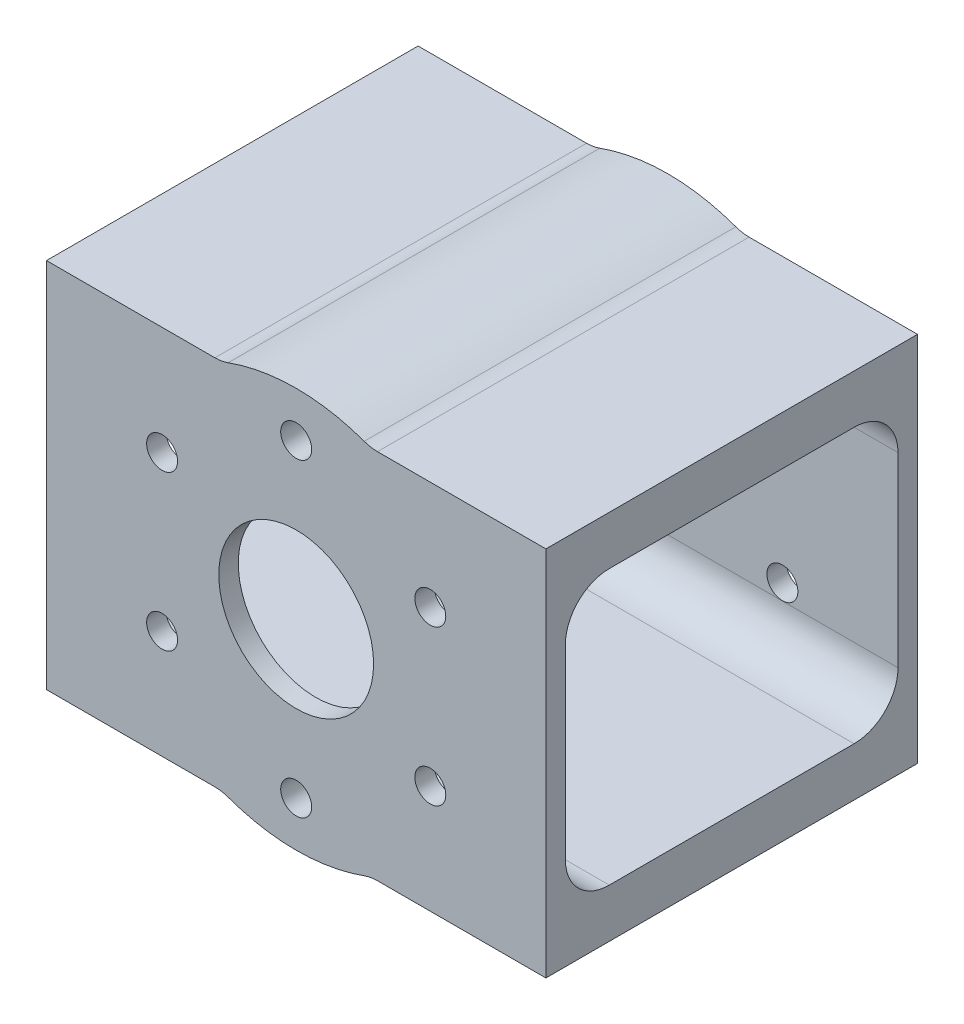
ISO-10303-21;
HEADER;
FILE_DESCRIPTION(('STEP AP214'),'2;1');
FILE_NAME('part.step','',(''),(''),'','','');
FILE_SCHEMA(('AUTOMOTIVE_DESIGN { 1 0 10303 214 1 1 1 1 }'));
ENDSEC;
DATA;
#1=APPLICATION_CONTEXT('core data for automotive mechanical design processes');
#2=APPLICATION_PROTOCOL_DEFINITION('international standard','automotive_design',2000,#1);
#3=PRODUCT_CONTEXT('',#1,'mechanical');
#4=PRODUCT('Part','Part','',(#3));
#5=PRODUCT_RELATED_PRODUCT_CATEGORY('part','',(#4));
#6=PRODUCT_DEFINITION_FORMATION('','',#4);
#7=PRODUCT_DEFINITION_CONTEXT('part definition',#1,'design');
#8=PRODUCT_DEFINITION('design','',#6,#7);
#9=PRODUCT_DEFINITION_SHAPE('','',#8);
#10=(LENGTH_UNIT() NAMED_UNIT(*) SI_UNIT(.MILLI.,.METRE.));
#11=(NAMED_UNIT(*) PLANE_ANGLE_UNIT() SI_UNIT($,.RADIAN.));
#12=(NAMED_UNIT(*) SI_UNIT($,.STERADIAN.) SOLID_ANGLE_UNIT());
#13=UNCERTAINTY_MEASURE_WITH_UNIT(LENGTH_MEASURE(1.E-05),#10,'distance_accuracy_value','');
#14=(GEOMETRIC_REPRESENTATION_CONTEXT(3) GLOBAL_UNCERTAINTY_ASSIGNED_CONTEXT((#13)) GLOBAL_UNIT_ASSIGNED_CONTEXT((#10,
#11,#12)) REPRESENTATION_CONTEXT('',''));
#15=CARTESIAN_POINT('',(0.,0.,0.));
#16=DIRECTION('',(0.,0.,1.));
#17=DIRECTION('',(1.,0.,0.));
#18=AXIS2_PLACEMENT_3D('',#15,#16,#17);
#19=CARTESIAN_POINT('',(-27.4963065701559,15.875,1.5875));
#20=DIRECTION('',(0.,0.,-1.));
#21=DIRECTION('',(-1.,0.,0.));
#22=AXIS2_PLACEMENT_3D('',#19,#20,#21);
#23=CYLINDRICAL_SURFACE('',#22,3.175);
#24=CARTESIAN_POINT('',(-27.4963065701559,15.875,2.41249999999999));
#25=DIRECTION('',(0.,0.,-1.));
#26=DIRECTION('',(-1.,0.,0.));
#27=AXIS2_PLACEMENT_3D('',#24,#25,#26);
#28=CIRCLE('',#27,3.175);
#29=CARTESIAN_POINT('',(-30.6713065701559,15.875,2.41249999999999));
#30=VERTEX_POINT('',#29);
#31=EDGE_CURVE('E751',#30,#30,#28,.T.);
#32=ORIENTED_EDGE('',*,*,#31,.F.);
#33=EDGE_LOOP('',(#32));
#34=FACE_BOUND('',#33,.T.);
#35=CARTESIAN_POINT('',(-27.4963065701559,15.875,-1.5875));
#36=DIRECTION('',(0.,0.,1.));
#37=DIRECTION('',(1.,0.,0.));
#38=AXIS2_PLACEMENT_3D('',#35,#36,#37);
#39=CIRCLE('',#38,3.175);
#40=CARTESIAN_POINT('',(-24.3213065701559,15.875,-1.5875));
#41=VERTEX_POINT('',#40);
#42=EDGE_CURVE('E571',#41,#41,#39,.T.);
#43=ORIENTED_EDGE('',*,*,#42,.F.);
#44=EDGE_LOOP('',(#43));
#45=FACE_BOUND('',#44,.T.);
#46=ADVANCED_FACE('F316',(#34,#45),#23,.F.);
#47=CARTESIAN_POINT('',(27.4963065701559,15.875,1.5875));
#48=DIRECTION('',(0.,0.,-1.));
#49=DIRECTION('',(-1.,0.,0.));
#50=AXIS2_PLACEMENT_3D('',#47,#48,#49);
#51=CYLINDRICAL_SURFACE('',#50,3.175);
#52=CARTESIAN_POINT('',(27.4963065701559,15.875,2.41249999999999));
#53=DIRECTION('',(0.,0.,-1.));
#54=DIRECTION('',(-1.,0.,0.));
#55=AXIS2_PLACEMENT_3D('',#52,#53,#54);
#56=CIRCLE('',#55,3.175);
#57=CARTESIAN_POINT('',(24.3213065701559,15.875,2.41249999999999));
#58=VERTEX_POINT('',#57);
#59=EDGE_CURVE('E750',#58,#58,#56,.T.);
#60=ORIENTED_EDGE('',*,*,#59,.F.);
#61=EDGE_LOOP('',(#60));
#62=FACE_BOUND('',#61,.T.);
#63=CARTESIAN_POINT('',(27.4963065701559,15.875,-1.5875));
#64=DIRECTION('',(0.,0.,1.));
#65=DIRECTION('',(1.,0.,0.));
#66=AXIS2_PLACEMENT_3D('',#63,#64,#65);
#67=CIRCLE('',#66,3.175);
#68=CARTESIAN_POINT('',(30.6713065701559,15.875,-1.5875));
#69=VERTEX_POINT('',#68);
#70=EDGE_CURVE('E569',#69,#69,#67,.T.);
#71=ORIENTED_EDGE('',*,*,#70,.F.);
#72=EDGE_LOOP('',(#71));
#73=FACE_BOUND('',#72,.T.);
#74=ADVANCED_FACE('F795',(#62,#73),#51,.F.);
#75=CARTESIAN_POINT('',(27.4963065701559,-15.875,1.5875));
#76=DIRECTION('',(0.,0.,-1.));
#77=DIRECTION('',(-1.,0.,0.));
#78=AXIS2_PLACEMENT_3D('',#75,#76,#77);
#79=CYLINDRICAL_SURFACE('',#78,3.175);
#80=CARTESIAN_POINT('',(27.4963065701559,-15.875,2.41249999999999));
#81=DIRECTION('',(0.,0.,-1.));
#82=DIRECTION('',(-1.,0.,0.));
#83=AXIS2_PLACEMENT_3D('',#80,#81,#82);
#84=CIRCLE('',#83,3.175);
#85=CARTESIAN_POINT('',(24.3213065701559,-15.875,2.41249999999999));
#86=VERTEX_POINT('',#85);
#87=EDGE_CURVE('E742',#86,#86,#84,.T.);
#88=ORIENTED_EDGE('',*,*,#87,.F.);
#89=EDGE_LOOP('',(#88));
#90=FACE_BOUND('',#89,.T.);
#91=CARTESIAN_POINT('',(27.4963065701559,-15.875,-1.5875));
#92=DIRECTION('',(0.,0.,1.));
#93=DIRECTION('',(1.,0.,0.));
#94=AXIS2_PLACEMENT_3D('',#91,#92,#93);
#95=CIRCLE('',#94,3.175);
#96=CARTESIAN_POINT('',(30.6713065701559,-15.875,-1.5875));
#97=VERTEX_POINT('',#96);
#98=EDGE_CURVE('E562',#97,#97,#95,.T.);
#99=ORIENTED_EDGE('',*,*,#98,.F.);
#100=EDGE_LOOP('',(#99));
#101=FACE_BOUND('',#100,.T.);
#102=ADVANCED_FACE('F803',(#90,#101),#79,.F.);
#103=CARTESIAN_POINT('',(-27.4963065701559,-15.875,1.5875));
#104=DIRECTION('',(0.,0.,-1.));
#105=DIRECTION('',(-1.,0.,0.));
#106=AXIS2_PLACEMENT_3D('',#103,#104,#105);
#107=CYLINDRICAL_SURFACE('',#106,3.175);
#108=CARTESIAN_POINT('',(-27.4963065701559,-15.875,2.41249999999999));
#109=DIRECTION('',(0.,0.,-1.));
#110=DIRECTION('',(-1.,0.,0.));
#111=AXIS2_PLACEMENT_3D('',#108,#109,#110);
#112=CIRCLE('',#111,3.175);
#113=CARTESIAN_POINT('',(-30.6713065701559,-15.875,2.41249999999999));
#114=VERTEX_POINT('',#113);
#115=EDGE_CURVE('E743',#114,#114,#112,.T.);
#116=ORIENTED_EDGE('',*,*,#115,.F.);
#117=EDGE_LOOP('',(#116));
#118=FACE_BOUND('',#117,.T.);
#119=CARTESIAN_POINT('',(-27.4963065701559,-15.875,-1.5875));
#120=DIRECTION('',(0.,0.,1.));
#121=DIRECTION('',(1.,0.,0.));
#122=AXIS2_PLACEMENT_3D('',#119,#120,#121);
#123=CIRCLE('',#122,3.175);
#124=CARTESIAN_POINT('',(-24.3213065701559,-15.875,-1.5875));
#125=VERTEX_POINT('',#124);
#126=EDGE_CURVE('E563',#125,#125,#123,.T.);
#127=ORIENTED_EDGE('',*,*,#126,.F.);
#128=EDGE_LOOP('',(#127));
#129=FACE_BOUND('',#128,.T.);
#130=ADVANCED_FACE('F879',(#118,#129),#107,.F.);
#131=CARTESIAN_POINT('',(0.,0.,1.5875));
#132=DIRECTION('',(0.,0.,-1.));
#133=DIRECTION('',(-1.,0.,0.));
#134=AXIS2_PLACEMENT_3D('',#131,#132,#133);
#135=CYLINDRICAL_SURFACE('',#134,15.875);
#136=CARTESIAN_POINT('',(0.,0.,2.41249999999999));
#137=DIRECTION('',(0.,0.,-1.));
#138=DIRECTION('',(-1.,0.,0.));
#139=AXIS2_PLACEMENT_3D('',#136,#137,#138);
#140=CIRCLE('',#139,15.875);
#141=CARTESIAN_POINT('',(-15.875,0.,2.41249999999999));
#142=VERTEX_POINT('',#141);
#143=EDGE_CURVE('E740',#142,#142,#140,.T.);
#144=ORIENTED_EDGE('',*,*,#143,.F.);
#145=EDGE_LOOP('',(#144));
#146=FACE_BOUND('',#145,.T.);
#147=CARTESIAN_POINT('',(0.,0.,-1.5875));
#148=DIRECTION('',(0.,0.,1.));
#149=DIRECTION('',(1.,0.,0.));
#150=AXIS2_PLACEMENT_3D('',#147,#148,#149);
#151=CIRCLE('',#150,15.875);
#152=CARTESIAN_POINT('',(15.875,0.,-1.5875));
#153=VERTEX_POINT('',#152);
#154=EDGE_CURVE('E560',#153,#153,#151,.T.);
#155=ORIENTED_EDGE('',*,*,#154,.F.);
#156=EDGE_LOOP('',(#155));
#157=FACE_BOUND('',#156,.T.);
#158=ADVANCED_FACE('F811',(#146,#157),#135,.F.);
#159=CARTESIAN_POINT('',(0.,0.,-1.5875));
#160=DIRECTION('',(0.,0.,-1.));
#161=DIRECTION('',(-1.,0.,0.));
#162=AXIS2_PLACEMENT_3D('',#159,#160,#161);
#163=PLANE('',#162);
#164=CARTESIAN_POINT('',(0.,-31.75,-1.5875));
#165=DIRECTION('',(0.,0.,1.));
#166=DIRECTION('',(1.,0.,0.));
#167=AXIS2_PLACEMENT_3D('',#164,#165,#166);
#168=CIRCLE('',#167,3.17500000000011);
#169=CARTESIAN_POINT('',(3.17500000000011,-31.75,-1.5875));
#170=VERTEX_POINT('',#169);
#171=EDGE_CURVE('E543',#170,#170,#168,.T.);
#172=ORIENTED_EDGE('',*,*,#171,.T.);
#173=EDGE_LOOP('',(#172));
#174=FACE_BOUND('',#173,.T.);
#175=ORIENTED_EDGE('',*,*,#154,.T.);
#176=EDGE_LOOP('',(#175));
#177=FACE_BOUND('',#176,.T.);
#178=ORIENTED_EDGE('',*,*,#98,.T.);
#179=EDGE_LOOP('',(#178));
#180=FACE_BOUND('',#179,.T.);
#181=ORIENTED_EDGE('',*,*,#42,.T.);
#182=EDGE_LOOP('',(#181));
#183=FACE_BOUND('',#182,.T.);
#184=ORIENTED_EDGE('',*,*,#70,.T.);
#185=EDGE_LOOP('',(#184));
#186=FACE_BOUND('',#185,.T.);
#187=ORIENTED_EDGE('',*,*,#126,.T.);
#188=EDGE_LOOP('',(#187));
#189=FACE_BOUND('',#188,.T.);
#190=CARTESIAN_POINT('',(0.,31.75,-1.5875));
#191=DIRECTION('',(0.,0.,1.));
#192=DIRECTION('',(1.,0.,0.));
#193=AXIS2_PLACEMENT_3D('',#190,#191,#192);
#194=CIRCLE('',#193,3.175);
#195=CARTESIAN_POINT('',(3.175,31.75,-1.5875));
#196=VERTEX_POINT('',#195);
#197=EDGE_CURVE('E554',#196,#196,#194,.T.);
#198=ORIENTED_EDGE('',*,*,#197,.T.);
#199=EDGE_LOOP('',(#198));
#200=FACE_BOUND('',#199,.T.);
#201=DIRECTION('',(1.,0.,0.));
#202=VECTOR('',#201,1.);
#203=CARTESIAN_POINT('',(15.2023827408732,38.1,-1.5875));
#204=LINE('',#203,#202);
#205=CARTESIAN_POINT('',(16.6687864285316,38.1,-1.5875));
#206=VERTEX_POINT('',#205);
#207=CARTESIAN_POINT('',(51.2023827408732,38.1,-1.5875));
#208=VERTEX_POINT('',#207);
#209=EDGE_CURVE('E463',#206,#208,#204,.T.);
#210=ORIENTED_EDGE('',*,*,#209,.T.);
#211=DIRECTION('',(0.,-1.,0.));
#212=VECTOR('',#211,1.);
#213=CARTESIAN_POINT('',(51.2023827408732,0.,-1.5875));
#214=LINE('',#213,#212);
#215=CARTESIAN_POINT('',(51.2023827408732,-38.1,-1.5875));
#216=VERTEX_POINT('',#215);
#217=EDGE_CURVE('E533',#208,#216,#214,.T.);
#218=ORIENTED_EDGE('',*,*,#217,.T.);
#219=DIRECTION('',(1.,0.,0.));
#220=VECTOR('',#219,1.);
#221=CARTESIAN_POINT('',(15.2023827408732,-38.1,-1.5875));
#222=LINE('',#221,#220);
#223=CARTESIAN_POINT('',(16.6687864285316,-38.1,-1.5875));
#224=VERTEX_POINT('',#223);
#225=EDGE_CURVE('E581',#224,#216,#222,.T.);
#226=ORIENTED_EDGE('',*,*,#225,.F.);
#227=CARTESIAN_POINT('',(16.6687864285316,-46.1,-1.5875));
#228=DIRECTION('',(0.,0.,-1.));
#229=DIRECTION('',(-1.,0.,0.));
#230=AXIS2_PLACEMENT_3D('',#227,#228,#229);
#231=CIRCLE('',#230,8.);
#232=CARTESIAN_POINT('',(13.948517739026,-38.5766936619,-1.5875));
#233=VERTEX_POINT('',#232);
#234=EDGE_CURVE('E612',#224,#233,#231,.F.);
#235=ORIENTED_EDGE('',*,*,#234,.T.);
#236=CARTESIAN_POINT('',(0.,0.,-1.5875));
#237=DIRECTION('',(0.,0.,1.));
#238=DIRECTION('',(1.,0.,0.));
#239=AXIS2_PLACEMENT_3D('',#236,#237,#238);
#240=CIRCLE('',#239,41.021);
#241=CARTESIAN_POINT('',(-13.948517739026,-38.5766936619,-1.5875));
#242=VERTEX_POINT('',#241);
#243=EDGE_CURVE('E590',#242,#233,#240,.T.);
#244=ORIENTED_EDGE('',*,*,#243,.F.);
#245=CARTESIAN_POINT('',(-16.6687864285316,-46.1,-1.5875));
#246=DIRECTION('',(0.,0.,-1.));
#247=DIRECTION('',(-1.,0.,0.));
#248=AXIS2_PLACEMENT_3D('',#245,#246,#247);
#249=CIRCLE('',#248,8.);
#250=CARTESIAN_POINT('',(-16.6687864285316,-38.1,-1.5875));
#251=VERTEX_POINT('',#250);
#252=EDGE_CURVE('E464',#242,#251,#249,.F.);
#253=ORIENTED_EDGE('',*,*,#252,.T.);
#254=DIRECTION('',(-1.,0.,0.));
#255=VECTOR('',#254,1.);
#256=CARTESIAN_POINT('',(-15.2023827408732,-38.1,-1.5875));
#257=LINE('',#256,#255);
#258=CARTESIAN_POINT('',(-51.2023827408732,-38.1,-1.5875));
#259=VERTEX_POINT('',#258);
#260=EDGE_CURVE('E591',#251,#259,#257,.T.);
#261=ORIENTED_EDGE('',*,*,#260,.T.);
#262=DIRECTION('',(0.,-1.,0.));
#263=VECTOR('',#262,1.);
#264=CARTESIAN_POINT('',(-51.2023827408732,0.,-1.5875));
#265=LINE('',#264,#263);
#266=CARTESIAN_POINT('',(-51.2023827408732,38.1,-1.5875));
#267=VERTEX_POINT('',#266);
#268=EDGE_CURVE('E529',#267,#259,#265,.T.);
#269=ORIENTED_EDGE('',*,*,#268,.F.);
#270=DIRECTION('',(-1.,0.,0.));
#271=VECTOR('',#270,1.);
#272=CARTESIAN_POINT('',(-15.2023827408732,38.1,-1.5875));
#273=LINE('',#272,#271);
#274=CARTESIAN_POINT('',(-16.6687864285316,38.1,-1.5875));
#275=VERTEX_POINT('',#274);
#276=EDGE_CURVE('E594',#275,#267,#273,.T.);
#277=ORIENTED_EDGE('',*,*,#276,.F.);
#278=CARTESIAN_POINT('',(-16.6687864285316,46.1,-1.5875));
#279=DIRECTION('',(0.,0.,-1.));
#280=DIRECTION('',(-1.,0.,0.));
#281=AXIS2_PLACEMENT_3D('',#278,#279,#280);
#282=CIRCLE('',#281,8.);
#283=CARTESIAN_POINT('',(-13.948517739026,38.5766936619,-1.5875));
#284=VERTEX_POINT('',#283);
#285=EDGE_CURVE('E620',#275,#284,#282,.F.);
#286=ORIENTED_EDGE('',*,*,#285,.T.);
#287=CARTESIAN_POINT('',(0.,0.,-1.5875));
#288=DIRECTION('',(0.,0.,-1.));
#289=DIRECTION('',(-1.,0.,0.));
#290=AXIS2_PLACEMENT_3D('',#287,#288,#289);
#291=CIRCLE('',#290,41.021);
#292=CARTESIAN_POINT('',(13.948517739026,38.5766936619,-1.5875));
#293=VERTEX_POINT('',#292);
#294=EDGE_CURVE('E580',#284,#293,#291,.T.);
#295=ORIENTED_EDGE('',*,*,#294,.T.);
#296=CARTESIAN_POINT('',(16.6687864285316,46.1,-1.5875));
#297=DIRECTION('',(0.,0.,-1.));
#298=DIRECTION('',(-1.,0.,0.));
#299=AXIS2_PLACEMENT_3D('',#296,#297,#298);
#300=CIRCLE('',#299,8.);
#301=EDGE_CURVE('E617',#293,#206,#300,.F.);
#302=ORIENTED_EDGE('',*,*,#301,.T.);
#303=EDGE_LOOP('',(#210,#218,#226,#235,#244,#253,#261,#269,#277,#286,#295,#302));
#304=FACE_BOUND('',#303,.T.);
#305=ADVANCED_FACE('F810',(#174,#177,#180,#183,#186,#189,#200,#304),#163,.T.);
#306=CARTESIAN_POINT('',(0.,0.,1.5875));
#307=DIRECTION('',(0.,0.,-1.));
#308=DIRECTION('',(-1.,0.,0.));
#309=AXIS2_PLACEMENT_3D('',#306,#307,#308);
#310=CYLINDRICAL_SURFACE('',#309,41.021);
#311=ORIENTED_EDGE('',*,*,#294,.F.);
#312=DIRECTION('',(0.,0.,-1.));
#313=VECTOR('',#312,1.);
#314=CARTESIAN_POINT('',(-13.948517739026,38.5766936619,1.5875));
#315=LINE('',#314,#313);
#316=CARTESIAN_POINT('',(-13.948517739026,38.5766936619,74.6125));
#317=VERTEX_POINT('',#316);
#318=EDGE_CURVE('E468',#284,#317,#315,.F.);
#319=ORIENTED_EDGE('',*,*,#318,.T.);
#320=CARTESIAN_POINT('',(0.,0.,74.6125));
#321=DIRECTION('',(0.,0.,1.));
#322=DIRECTION('',(1.,0.,0.));
#323=AXIS2_PLACEMENT_3D('',#320,#321,#322);
#324=CIRCLE('',#323,41.021);
#325=CARTESIAN_POINT('',(13.948517739026,38.5766936619,74.6125));
#326=VERTEX_POINT('',#325);
#327=EDGE_CURVE('E527',#326,#317,#324,.T.);
#328=ORIENTED_EDGE('',*,*,#327,.F.);
#329=DIRECTION('',(0.,0.,-1.));
#330=VECTOR('',#329,1.);
#331=CARTESIAN_POINT('',(13.948517739026,38.5766936619,1.5875));
#332=LINE('',#331,#330);
#333=EDGE_CURVE('E485',#326,#293,#332,.T.);
#334=ORIENTED_EDGE('',*,*,#333,.T.);
#335=EDGE_LOOP('',(#311,#319,#328,#334));
#336=FACE_BOUND('',#335,.T.);
#337=ADVANCED_FACE('F807',(#336),#310,.T.);
#338=CARTESIAN_POINT('',(-15.2023827408732,38.1,1.5875));
#339=DIRECTION('',(0.,-1.,0.));
#340=DIRECTION('',(0.,0.,-1.));
#341=AXIS2_PLACEMENT_3D('',#338,#339,#340);
#342=PLANE('',#341);
#343=ORIENTED_EDGE('',*,*,#276,.T.);
#344=DIRECTION('',(0.,0.,1.));
#345=VECTOR('',#344,1.);
#346=CARTESIAN_POINT('',(-51.2023827408732,38.1,-1.5875));
#347=LINE('',#346,#345);
#348=CARTESIAN_POINT('',(-51.2023827408732,38.1,74.6125));
#349=VERTEX_POINT('',#348);
#350=EDGE_CURVE('E537',#267,#349,#347,.T.);
#351=ORIENTED_EDGE('',*,*,#350,.T.);
#352=DIRECTION('',(-1.,0.,0.));
#353=VECTOR('',#352,1.);
#354=CARTESIAN_POINT('',(-16.6687864285316,38.1,74.6125));
#355=LINE('',#354,#353);
#356=CARTESIAN_POINT('',(-16.6687864285316,38.1,74.6125));
#357=VERTEX_POINT('',#356);
#358=EDGE_CURVE('E517',#357,#349,#355,.T.);
#359=ORIENTED_EDGE('',*,*,#358,.F.);
#360=DIRECTION('',(0.,0.,-1.));
#361=VECTOR('',#360,1.);
#362=CARTESIAN_POINT('',(-16.6687864285316,38.1,1.5875));
#363=LINE('',#362,#361);
#364=EDGE_CURVE('E606',#357,#275,#363,.T.);
#365=ORIENTED_EDGE('',*,*,#364,.T.);
#366=EDGE_LOOP('',(#343,#351,#359,#365));
#367=FACE_BOUND('',#366,.T.);
#368=ADVANCED_FACE('F826',(#367),#342,.F.);
#369=CARTESIAN_POINT('',(-15.2023827408732,-38.1,1.5875));
#370=DIRECTION('',(0.,-1.,0.));
#371=DIRECTION('',(0.,0.,-1.));
#372=AXIS2_PLACEMENT_3D('',#369,#370,#371);
#373=PLANE('',#372);
#374=DIRECTION('',(0.,0.,1.));
#375=VECTOR('',#374,1.);
#376=CARTESIAN_POINT('',(-51.2023827408732,-38.1,-1.5875));
#377=LINE('',#376,#375);
#378=CARTESIAN_POINT('',(-51.2023827408732,-38.1,74.6125));
#379=VERTEX_POINT('',#378);
#380=EDGE_CURVE('E536',#259,#379,#377,.T.);
#381=ORIENTED_EDGE('',*,*,#380,.F.);
#382=ORIENTED_EDGE('',*,*,#260,.F.);
#383=DIRECTION('',(0.,0.,-1.));
#384=VECTOR('',#383,1.);
#385=CARTESIAN_POINT('',(-16.6687864285316,-38.1,1.5875));
#386=LINE('',#385,#384);
#387=CARTESIAN_POINT('',(-16.6687864285316,-38.1,74.6125));
#388=VERTEX_POINT('',#387);
#389=EDGE_CURVE('E607',#251,#388,#386,.F.);
#390=ORIENTED_EDGE('',*,*,#389,.T.);
#391=DIRECTION('',(1.,0.,0.));
#392=VECTOR('',#391,1.);
#393=CARTESIAN_POINT('',(-51.2023827408732,-38.1,74.6125));
#394=LINE('',#393,#392);
#395=EDGE_CURVE('E512',#379,#388,#394,.T.);
#396=ORIENTED_EDGE('',*,*,#395,.F.);
#397=EDGE_LOOP('',(#381,#382,#390,#396));
#398=FACE_BOUND('',#397,.T.);
#399=ADVANCED_FACE('F836',(#398),#373,.T.);
#400=CARTESIAN_POINT('',(0.,0.,1.5875));
#401=DIRECTION('',(0.,0.,-1.));
#402=DIRECTION('',(-1.,0.,0.));
#403=AXIS2_PLACEMENT_3D('',#400,#401,#402);
#404=CYLINDRICAL_SURFACE('',#403,41.021);
#405=DIRECTION('',(0.,0.,-1.));
#406=VECTOR('',#405,1.);
#407=CARTESIAN_POINT('',(13.948517739026,-38.5766936619,1.5875));
#408=LINE('',#407,#406);
#409=CARTESIAN_POINT('',(13.948517739026,-38.5766936619,74.6125));
#410=VERTEX_POINT('',#409);
#411=EDGE_CURVE('E597',#233,#410,#408,.F.);
#412=ORIENTED_EDGE('',*,*,#411,.T.);
#413=CARTESIAN_POINT('',(0.,0.,74.6125));
#414=DIRECTION('',(0.,0.,1.));
#415=DIRECTION('',(1.,0.,0.));
#416=AXIS2_PLACEMENT_3D('',#413,#414,#415);
#417=CIRCLE('',#416,41.021);
#418=CARTESIAN_POINT('',(-13.948517739026,-38.5766936619,74.6125));
#419=VERTEX_POINT('',#418);
#420=EDGE_CURVE('E501',#419,#410,#417,.T.);
#421=ORIENTED_EDGE('',*,*,#420,.F.);
#422=DIRECTION('',(0.,0.,-1.));
#423=VECTOR('',#422,1.);
#424=CARTESIAN_POINT('',(-13.948517739026,-38.5766936619,1.5875));
#425=LINE('',#424,#423);
#426=EDGE_CURVE('E605',#419,#242,#425,.T.);
#427=ORIENTED_EDGE('',*,*,#426,.T.);
#428=ORIENTED_EDGE('',*,*,#243,.T.);
#429=EDGE_LOOP('',(#412,#421,#427,#428));
#430=FACE_BOUND('',#429,.T.);
#431=ADVANCED_FACE('F843',(#430),#404,.T.);
#432=CARTESIAN_POINT('',(15.2023827408732,-38.1,1.5875));
#433=DIRECTION('',(0.,1.,0.));
#434=DIRECTION('',(0.,0.,1.));
#435=AXIS2_PLACEMENT_3D('',#432,#433,#434);
#436=PLANE('',#435);
#437=ORIENTED_EDGE('',*,*,#225,.T.);
#438=DIRECTION('',(0.,0.,1.));
#439=VECTOR('',#438,1.);
#440=CARTESIAN_POINT('',(51.2023827408732,-38.1,-1.5875));
#441=LINE('',#440,#439);
#442=CARTESIAN_POINT('',(51.2023827408732,-38.1,74.6125));
#443=VERTEX_POINT('',#442);
#444=EDGE_CURVE('E539',#216,#443,#441,.T.);
#445=ORIENTED_EDGE('',*,*,#444,.T.);
#446=DIRECTION('',(1.,0.,0.));
#447=VECTOR('',#446,1.);
#448=CARTESIAN_POINT('',(16.6687864285316,-38.1,74.6125));
#449=LINE('',#448,#447);
#450=CARTESIAN_POINT('',(16.6687864285316,-38.1,74.6125));
#451=VERTEX_POINT('',#450);
#452=EDGE_CURVE('E497',#451,#443,#449,.T.);
#453=ORIENTED_EDGE('',*,*,#452,.F.);
#454=DIRECTION('',(0.,0.,1.));
#455=VECTOR('',#454,1.);
#456=CARTESIAN_POINT('',(16.6687864285316,-38.1,-1.5875));
#457=LINE('',#456,#455);
#458=EDGE_CURVE('E624',#451,#224,#457,.F.);
#459=ORIENTED_EDGE('',*,*,#458,.T.);
#460=EDGE_LOOP('',(#437,#445,#453,#459));
#461=FACE_BOUND('',#460,.T.);
#462=ADVANCED_FACE('F791',(#461),#436,.F.);
#463=CARTESIAN_POINT('',(15.2023827408732,38.1,1.5875));
#464=DIRECTION('',(0.,1.,0.));
#465=DIRECTION('',(0.,0.,1.));
#466=AXIS2_PLACEMENT_3D('',#463,#464,#465);
#467=PLANE('',#466);
#468=DIRECTION('',(0.,0.,1.));
#469=VECTOR('',#468,1.);
#470=CARTESIAN_POINT('',(51.2023827408732,38.1,-1.5875));
#471=LINE('',#470,#469);
#472=CARTESIAN_POINT('',(51.2023827408732,38.1,74.6125));
#473=VERTEX_POINT('',#472);
#474=EDGE_CURVE('E532',#208,#473,#471,.T.);
#475=ORIENTED_EDGE('',*,*,#474,.F.);
#476=ORIENTED_EDGE('',*,*,#209,.F.);
#477=DIRECTION('',(0.,0.,1.));
#478=VECTOR('',#477,1.);
#479=CARTESIAN_POINT('',(16.6687864285316,38.1,1.5875));
#480=LINE('',#479,#478);
#481=CARTESIAN_POINT('',(16.6687864285316,38.1,74.6125));
#482=VERTEX_POINT('',#481);
#483=EDGE_CURVE('E452',#206,#482,#480,.T.);
#484=ORIENTED_EDGE('',*,*,#483,.T.);
#485=DIRECTION('',(-1.,0.,0.));
#486=VECTOR('',#485,1.);
#487=CARTESIAN_POINT('',(51.2023827408732,38.1,74.6125));
#488=LINE('',#487,#486);
#489=EDGE_CURVE('E459',#473,#482,#488,.T.);
#490=ORIENTED_EDGE('',*,*,#489,.F.);
#491=EDGE_LOOP('',(#475,#476,#484,#490));
#492=FACE_BOUND('',#491,.T.);
#493=ADVANCED_FACE('F456',(#492),#467,.T.);
#494=CARTESIAN_POINT('',(-27.4963065701559,15.875,70.6125));
#495=DIRECTION('',(0.,0.,1.));
#496=DIRECTION('',(1.,0.,0.));
#497=AXIS2_PLACEMENT_3D('',#494,#495,#496);
#498=CIRCLE('',#497,3.175);
#499=CARTESIAN_POINT('',(-24.3213065701559,15.875,70.6125));
#500=VERTEX_POINT('',#499);
#501=EDGE_CURVE('E731',#500,#500,#498,.T.);
#502=ORIENTED_EDGE('',*,*,#501,.F.);
#503=EDGE_LOOP('',(#502));
#504=FACE_BOUND('',#503,.T.);
#505=CARTESIAN_POINT('',(-27.4963065701559,15.875,74.6125));
#506=DIRECTION('',(0.,0.,1.));
#507=DIRECTION('',(1.,0.,0.));
#508=AXIS2_PLACEMENT_3D('',#505,#506,#507);
#509=CIRCLE('',#508,3.175);
#510=CARTESIAN_POINT('',(-24.3213065701559,15.875,74.6125));
#511=VERTEX_POINT('',#510);
#512=EDGE_CURVE('E489',#511,#511,#509,.F.);
#513=ORIENTED_EDGE('',*,*,#512,.F.);
#514=EDGE_LOOP('',(#513));
#515=FACE_BOUND('',#514,.T.);
#516=ADVANCED_FACE('F783',(#504,#515),#23,.F.);
#517=CARTESIAN_POINT('',(27.4963065701559,15.875,70.6125));
#518=DIRECTION('',(0.,0.,1.));
#519=DIRECTION('',(1.,0.,0.));
#520=AXIS2_PLACEMENT_3D('',#517,#518,#519);
#521=CIRCLE('',#520,3.175);
#522=CARTESIAN_POINT('',(30.6713065701559,15.875,70.6125));
#523=VERTEX_POINT('',#522);
#524=EDGE_CURVE('E729',#523,#523,#521,.T.);
#525=ORIENTED_EDGE('',*,*,#524,.F.);
#526=EDGE_LOOP('',(#525));
#527=FACE_BOUND('',#526,.T.);
#528=CARTESIAN_POINT('',(27.4963065701559,15.875,74.6125));
#529=DIRECTION('',(0.,0.,1.));
#530=DIRECTION('',(1.,0.,0.));
#531=AXIS2_PLACEMENT_3D('',#528,#529,#530);
#532=CIRCLE('',#531,3.175);
#533=CARTESIAN_POINT('',(30.6713065701559,15.875,74.6125));
#534=VERTEX_POINT('',#533);
#535=EDGE_CURVE('E761',#534,#534,#532,.T.);
#536=ORIENTED_EDGE('',*,*,#535,.T.);
#537=EDGE_LOOP('',(#536));
#538=FACE_BOUND('',#537,.T.);
#539=ADVANCED_FACE('F781',(#527,#538),#51,.F.);
#540=CARTESIAN_POINT('',(27.4963065701559,-15.875,70.6125));
#541=DIRECTION('',(0.,0.,1.));
#542=DIRECTION('',(1.,0.,0.));
#543=AXIS2_PLACEMENT_3D('',#540,#541,#542);
#544=CIRCLE('',#543,3.175);
#545=CARTESIAN_POINT('',(30.6713065701559,-15.875,70.6125));
#546=VERTEX_POINT('',#545);
#547=EDGE_CURVE('E724',#546,#546,#544,.T.);
#548=ORIENTED_EDGE('',*,*,#547,.F.);
#549=EDGE_LOOP('',(#548));
#550=FACE_BOUND('',#549,.T.);
#551=CARTESIAN_POINT('',(27.4963065701559,-15.875,74.6125));
#552=DIRECTION('',(0.,0.,1.));
#553=DIRECTION('',(1.,0.,0.));
#554=AXIS2_PLACEMENT_3D('',#551,#552,#553);
#555=CIRCLE('',#554,3.175);
#556=CARTESIAN_POINT('',(30.6713065701559,-15.875,74.6125));
#557=VERTEX_POINT('',#556);
#558=EDGE_CURVE('E764',#557,#557,#555,.T.);
#559=ORIENTED_EDGE('',*,*,#558,.T.);
#560=EDGE_LOOP('',(#559));
#561=FACE_BOUND('',#560,.T.);
#562=ADVANCED_FACE('F789',(#550,#561),#79,.F.);
#563=CARTESIAN_POINT('',(-27.4963065701559,-15.875,70.6125));
#564=DIRECTION('',(0.,0.,1.));
#565=DIRECTION('',(1.,0.,0.));
#566=AXIS2_PLACEMENT_3D('',#563,#564,#565);
#567=CIRCLE('',#566,3.175);
#568=CARTESIAN_POINT('',(-24.3213065701559,-15.875,70.6125));
#569=VERTEX_POINT('',#568);
#570=EDGE_CURVE('E704',#569,#569,#567,.T.);
#571=ORIENTED_EDGE('',*,*,#570,.F.);
#572=EDGE_LOOP('',(#571));
#573=FACE_BOUND('',#572,.T.);
#574=CARTESIAN_POINT('',(-27.4963065701559,-15.875,74.6125));
#575=DIRECTION('',(0.,0.,1.));
#576=DIRECTION('',(1.,0.,0.));
#577=AXIS2_PLACEMENT_3D('',#574,#575,#576);
#578=CIRCLE('',#577,3.175);
#579=CARTESIAN_POINT('',(-24.3213065701559,-15.875,74.6125));
#580=VERTEX_POINT('',#579);
#581=EDGE_CURVE('E768',#580,#580,#578,.T.);
#582=ORIENTED_EDGE('',*,*,#581,.T.);
#583=EDGE_LOOP('',(#582));
#584=FACE_BOUND('',#583,.T.);
#585=ADVANCED_FACE('F874',(#573,#584),#107,.F.);
#586=CARTESIAN_POINT('',(0.,0.,70.6125));
#587=DIRECTION('',(0.,0.,1.));
#588=DIRECTION('',(1.,0.,0.));
#589=AXIS2_PLACEMENT_3D('',#586,#587,#588);
#590=CIRCLE('',#589,15.875);
#591=CARTESIAN_POINT('',(15.875,0.,70.6125));
#592=VERTEX_POINT('',#591);
#593=EDGE_CURVE('E699',#592,#592,#590,.T.);
#594=ORIENTED_EDGE('',*,*,#593,.F.);
#595=EDGE_LOOP('',(#594));
#596=FACE_BOUND('',#595,.T.);
#597=CARTESIAN_POINT('',(0.,0.,74.6125));
#598=DIRECTION('',(0.,0.,1.));
#599=DIRECTION('',(1.,0.,0.));
#600=AXIS2_PLACEMENT_3D('',#597,#598,#599);
#601=CIRCLE('',#600,15.875);
#602=CARTESIAN_POINT('',(15.875,0.,74.6125));
#603=VERTEX_POINT('',#602);
#604=EDGE_CURVE('E484',#603,#603,#601,.F.);
#605=ORIENTED_EDGE('',*,*,#604,.F.);
#606=EDGE_LOOP('',(#605));
#607=FACE_BOUND('',#606,.T.);
#608=ADVANCED_FACE('F871',(#596,#607),#135,.F.);
#609=CARTESIAN_POINT('',(0.,31.75,1.5875));
#610=DIRECTION('',(0.,0.,-1.));
#611=DIRECTION('',(-1.,0.,0.));
#612=AXIS2_PLACEMENT_3D('',#609,#610,#611);
#613=CYLINDRICAL_SURFACE('',#612,3.175);
#614=ORIENTED_EDGE('',*,*,#197,.F.);
#615=EDGE_LOOP('',(#614));
#616=FACE_BOUND('',#615,.T.);
#617=CARTESIAN_POINT('',(0.,31.75,74.6125));
#618=DIRECTION('',(0.,0.,1.));
#619=DIRECTION('',(1.,0.,0.));
#620=AXIS2_PLACEMENT_3D('',#617,#618,#619);
#621=CIRCLE('',#620,3.175);
#622=CARTESIAN_POINT('',(3.175,31.75,74.6125));
#623=VERTEX_POINT('',#622);
#624=EDGE_CURVE('E760',#623,#623,#621,.T.);
#625=ORIENTED_EDGE('',*,*,#624,.T.);
#626=EDGE_LOOP('',(#625));
#627=FACE_BOUND('',#626,.T.);
#628=ADVANCED_FACE('F870',(#616,#627),#613,.F.);
#629=CARTESIAN_POINT('',(0.,-31.75,1.5875));
#630=DIRECTION('',(0.,0.,-1.));
#631=DIRECTION('',(-1.,0.,0.));
#632=AXIS2_PLACEMENT_3D('',#629,#630,#631);
#633=CYLINDRICAL_SURFACE('',#632,3.17500000000011);
#634=ORIENTED_EDGE('',*,*,#171,.F.);
#635=EDGE_LOOP('',(#634));
#636=FACE_BOUND('',#635,.T.);
#637=CARTESIAN_POINT('',(0.,-31.75,74.6125));
#638=DIRECTION('',(0.,0.,1.));
#639=DIRECTION('',(1.,0.,0.));
#640=AXIS2_PLACEMENT_3D('',#637,#638,#639);
#641=CIRCLE('',#640,3.17500000000011);
#642=CARTESIAN_POINT('',(3.17500000000011,-31.75,74.6125));
#643=VERTEX_POINT('',#642);
#644=EDGE_CURVE('E774',#643,#643,#641,.F.);
#645=ORIENTED_EDGE('',*,*,#644,.F.);
#646=EDGE_LOOP('',(#645));
#647=FACE_BOUND('',#646,.T.);
#648=ADVANCED_FACE('F864',(#636,#647),#633,.F.);
#649=CARTESIAN_POINT('',(-16.6687864285316,-46.1,1.5875));
#650=DIRECTION('',(0.,0.,-1.));
#651=DIRECTION('',(-1.,0.,0.));
#652=AXIS2_PLACEMENT_3D('',#649,#650,#651);
#653=CYLINDRICAL_SURFACE('',#652,8.);
#654=ORIENTED_EDGE('',*,*,#426,.F.);
#655=CARTESIAN_POINT('',(-16.6687864285316,-46.1,74.6125));
#656=DIRECTION('',(0.,0.,1.));
#657=DIRECTION('',(1.,0.,0.));
#658=AXIS2_PLACEMENT_3D('',#655,#656,#657);
#659=CIRCLE('',#658,8.);
#660=EDGE_CURVE('E510',#419,#388,#659,.T.);
#661=ORIENTED_EDGE('',*,*,#660,.T.);
#662=ORIENTED_EDGE('',*,*,#389,.F.);
#663=ORIENTED_EDGE('',*,*,#252,.F.);
#664=EDGE_LOOP('',(#654,#661,#662,#663));
#665=FACE_BOUND('',#664,.T.);
#666=ADVANCED_FACE('F845',(#665),#653,.F.);
#667=CARTESIAN_POINT('',(16.6687864285316,-46.1,1.5875));
#668=DIRECTION('',(0.,0.,-1.));
#669=DIRECTION('',(-1.,0.,0.));
#670=AXIS2_PLACEMENT_3D('',#667,#668,#669);
#671=CYLINDRICAL_SURFACE('',#670,8.);
#672=ORIENTED_EDGE('',*,*,#458,.F.);
#673=CARTESIAN_POINT('',(16.6687864285316,-46.1,74.6125));
#674=DIRECTION('',(0.,0.,1.));
#675=DIRECTION('',(1.,0.,0.));
#676=AXIS2_PLACEMENT_3D('',#673,#674,#675);
#677=CIRCLE('',#676,7.99999999999999);
#678=EDGE_CURVE('E496',#451,#410,#677,.T.);
#679=ORIENTED_EDGE('',*,*,#678,.T.);
#680=ORIENTED_EDGE('',*,*,#411,.F.);
#681=ORIENTED_EDGE('',*,*,#234,.F.);
#682=EDGE_LOOP('',(#672,#679,#680,#681));
#683=FACE_BOUND('',#682,.T.);
#684=ADVANCED_FACE('F849',(#683),#671,.F.);
#685=CARTESIAN_POINT('',(-16.6687864285316,46.1,1.5875));
#686=DIRECTION('',(0.,0.,-1.));
#687=DIRECTION('',(-1.,0.,0.));
#688=AXIS2_PLACEMENT_3D('',#685,#686,#687);
#689=CYLINDRICAL_SURFACE('',#688,8.);
#690=ORIENTED_EDGE('',*,*,#364,.F.);
#691=CARTESIAN_POINT('',(-16.6687864285316,46.1,74.6125));
#692=DIRECTION('',(0.,0.,1.));
#693=DIRECTION('',(1.,0.,0.));
#694=AXIS2_PLACEMENT_3D('',#691,#692,#693);
#695=CIRCLE('',#694,7.99999999999999);
#696=EDGE_CURVE('E521',#357,#317,#695,.T.);
#697=ORIENTED_EDGE('',*,*,#696,.T.);
#698=ORIENTED_EDGE('',*,*,#318,.F.);
#699=ORIENTED_EDGE('',*,*,#285,.F.);
#700=EDGE_LOOP('',(#690,#697,#698,#699));
#701=FACE_BOUND('',#700,.T.);
#702=ADVANCED_FACE('F824',(#701),#689,.F.);
#703=CARTESIAN_POINT('',(16.6687864285316,46.1,1.5875));
#704=DIRECTION('',(0.,0.,-1.));
#705=DIRECTION('',(-1.,0.,0.));
#706=AXIS2_PLACEMENT_3D('',#703,#704,#705);
#707=CYLINDRICAL_SURFACE('',#706,8.);
#708=ORIENTED_EDGE('',*,*,#333,.F.);
#709=CARTESIAN_POINT('',(16.6687864285316,46.1,74.6125));
#710=DIRECTION('',(0.,0.,1.));
#711=DIRECTION('',(1.,0.,0.));
#712=AXIS2_PLACEMENT_3D('',#709,#710,#711);
#713=CIRCLE('',#712,8.);
#714=EDGE_CURVE('E475',#326,#482,#713,.T.);
#715=ORIENTED_EDGE('',*,*,#714,.T.);
#716=ORIENTED_EDGE('',*,*,#483,.F.);
#717=ORIENTED_EDGE('',*,*,#301,.F.);
#718=EDGE_LOOP('',(#708,#715,#716,#717));
#719=FACE_BOUND('',#718,.T.);
#720=ADVANCED_FACE('F477',(#719),#707,.F.);
#721=CARTESIAN_POINT('',(-51.2023827408732,0.,-1.5875));
#722=DIRECTION('',(-1.,0.,0.));
#723=DIRECTION('',(0.,-1.,0.));
#724=AXIS2_PLACEMENT_3D('',#721,#722,#723);
#725=PLANE('',#724);
#726=DIRECTION('',(0.,0.,-1.));
#727=VECTOR('',#726,1.);
#728=CARTESIAN_POINT('',(-51.2023827408732,-28.1,70.6125));
#729=LINE('',#728,#727);
#730=CARTESIAN_POINT('',(-51.2023827408732,-28.1,61.6125));
#731=VERTEX_POINT('',#730);
#732=CARTESIAN_POINT('',(-51.2023827408732,-28.1,11.4125));
#733=VERTEX_POINT('',#732);
#734=EDGE_CURVE('E698',#731,#733,#729,.T.);
#735=ORIENTED_EDGE('',*,*,#734,.T.);
#736=CARTESIAN_POINT('',(-51.2023827408732,-19.1,11.4125));
#737=DIRECTION('',(-1.,0.,0.));
#738=DIRECTION('',(0.,-1.,0.));
#739=AXIS2_PLACEMENT_3D('',#736,#737,#738);
#740=CIRCLE('',#739,9.);
#741=CARTESIAN_POINT('',(-51.2023827408732,-19.1,2.41249999999999));
#742=VERTEX_POINT('',#741);
#743=EDGE_CURVE('E671',#733,#742,#740,.F.);
#744=ORIENTED_EDGE('',*,*,#743,.T.);
#745=DIRECTION('',(0.,1.,0.));
#746=VECTOR('',#745,1.);
#747=CARTESIAN_POINT('',(-51.2023827408732,28.1,2.41249999999999));
#748=LINE('',#747,#746);
#749=CARTESIAN_POINT('',(-51.2023827408732,19.1,2.41249999999999));
#750=VERTEX_POINT('',#749);
#751=EDGE_CURVE('E718',#742,#750,#748,.T.);
#752=ORIENTED_EDGE('',*,*,#751,.T.);
#753=CARTESIAN_POINT('',(-51.2023827408732,19.1,11.4125));
#754=DIRECTION('',(-1.,0.,0.));
#755=DIRECTION('',(0.,-1.,0.));
#756=AXIS2_PLACEMENT_3D('',#753,#754,#755);
#757=CIRCLE('',#756,9.);
#758=CARTESIAN_POINT('',(-51.2023827408732,28.1,11.4125));
#759=VERTEX_POINT('',#758);
#760=EDGE_CURVE('E666',#750,#759,#757,.F.);
#761=ORIENTED_EDGE('',*,*,#760,.T.);
#762=DIRECTION('',(0.,0.,1.));
#763=VECTOR('',#762,1.);
#764=CARTESIAN_POINT('',(-51.2023827408732,28.1,70.6125));
#765=LINE('',#764,#763);
#766=CARTESIAN_POINT('',(-51.2023827408732,28.1,61.6125));
#767=VERTEX_POINT('',#766);
#768=EDGE_CURVE('E708',#759,#767,#765,.T.);
#769=ORIENTED_EDGE('',*,*,#768,.T.);
#770=CARTESIAN_POINT('',(-51.2023827408732,19.1,61.6125));
#771=DIRECTION('',(-1.,0.,0.));
#772=DIRECTION('',(0.,-1.,0.));
#773=AXIS2_PLACEMENT_3D('',#770,#771,#772);
#774=CIRCLE('',#773,9.);
#775=CARTESIAN_POINT('',(-51.2023827408732,19.1,70.6125));
#776=VERTEX_POINT('',#775);
#777=EDGE_CURVE('E665',#767,#776,#774,.F.);
#778=ORIENTED_EDGE('',*,*,#777,.T.);
#779=DIRECTION('',(0.,-1.,0.));
#780=VECTOR('',#779,1.);
#781=CARTESIAN_POINT('',(-51.2023827408732,28.1,70.6125));
#782=LINE('',#781,#780);
#783=CARTESIAN_POINT('',(-51.2023827408732,-19.1,70.6125));
#784=VERTEX_POINT('',#783);
#785=EDGE_CURVE('E697',#776,#784,#782,.T.);
#786=ORIENTED_EDGE('',*,*,#785,.T.);
#787=CARTESIAN_POINT('',(-51.2023827408732,-19.1,61.6125));
#788=DIRECTION('',(-1.,0.,0.));
#789=DIRECTION('',(0.,-1.,0.));
#790=AXIS2_PLACEMENT_3D('',#787,#788,#789);
#791=CIRCLE('',#790,9.);
#792=EDGE_CURVE('E12',#784,#731,#791,.F.);
#793=ORIENTED_EDGE('',*,*,#792,.T.);
#794=EDGE_LOOP('',(#735,#744,#752,#761,#769,#778,#786,#793));
#795=FACE_BOUND('',#794,.T.);
#796=ORIENTED_EDGE('',*,*,#350,.F.);
#797=ORIENTED_EDGE('',*,*,#268,.T.);
#798=ORIENTED_EDGE('',*,*,#380,.T.);
#799=DIRECTION('',(0.,-1.,0.));
#800=VECTOR('',#799,1.);
#801=CARTESIAN_POINT('',(-51.2023827408732,38.1,74.6125));
#802=LINE('',#801,#800);
#803=EDGE_CURVE('E513',#349,#379,#802,.T.);
#804=ORIENTED_EDGE('',*,*,#803,.F.);
#805=EDGE_LOOP('',(#796,#797,#798,#804));
#806=FACE_BOUND('',#805,.T.);
#807=ADVANCED_FACE('F831',(#795,#806),#725,.T.);
#808=CARTESIAN_POINT('',(51.2023827408732,0.,-1.5875));
#809=DIRECTION('',(-1.,0.,0.));
#810=DIRECTION('',(0.,-1.,0.));
#811=AXIS2_PLACEMENT_3D('',#808,#809,#810);
#812=PLANE('',#811);
#813=DIRECTION('',(0.,0.,1.));
#814=VECTOR('',#813,1.);
#815=CARTESIAN_POINT('',(51.2023827408732,28.1,70.6125));
#816=LINE('',#815,#814);
#817=CARTESIAN_POINT('',(51.2023827408732,28.1,11.4125));
#818=VERTEX_POINT('',#817);
#819=CARTESIAN_POINT('',(51.2023827408732,28.1,61.6125));
#820=VERTEX_POINT('',#819);
#821=EDGE_CURVE('E691',#818,#820,#816,.T.);
#822=ORIENTED_EDGE('',*,*,#821,.F.);
#823=CARTESIAN_POINT('',(51.2023827408732,19.1,11.4125));
#824=DIRECTION('',(-1.,0.,0.));
#825=DIRECTION('',(0.,-1.,0.));
#826=AXIS2_PLACEMENT_3D('',#823,#824,#825);
#827=CIRCLE('',#826,9.);
#828=CARTESIAN_POINT('',(51.2023827408732,19.1,2.41249999999999));
#829=VERTEX_POINT('',#828);
#830=EDGE_CURVE('E663',#818,#829,#827,.T.);
#831=ORIENTED_EDGE('',*,*,#830,.T.);
#832=DIRECTION('',(0.,1.,0.));
#833=VECTOR('',#832,1.);
#834=CARTESIAN_POINT('',(51.2023827408732,28.1,2.41249999999999));
#835=LINE('',#834,#833);
#836=CARTESIAN_POINT('',(51.2023827408732,-19.1,2.41249999999999));
#837=VERTEX_POINT('',#836);
#838=EDGE_CURVE('E715',#837,#829,#835,.T.);
#839=ORIENTED_EDGE('',*,*,#838,.F.);
#840=CARTESIAN_POINT('',(51.2023827408732,-19.1,11.4125));
#841=DIRECTION('',(-1.,0.,0.));
#842=DIRECTION('',(0.,-1.,0.));
#843=AXIS2_PLACEMENT_3D('',#840,#841,#842);
#844=CIRCLE('',#843,9.);
#845=CARTESIAN_POINT('',(51.2023827408732,-28.1,11.4125));
#846=VERTEX_POINT('',#845);
#847=EDGE_CURVE('E673',#837,#846,#844,.T.);
#848=ORIENTED_EDGE('',*,*,#847,.T.);
#849=DIRECTION('',(0.,0.,-1.));
#850=VECTOR('',#849,1.);
#851=CARTESIAN_POINT('',(51.2023827408732,-28.1,70.6125));
#852=LINE('',#851,#850);
#853=CARTESIAN_POINT('',(51.2023827408732,-28.1,61.6125));
#854=VERTEX_POINT('',#853);
#855=EDGE_CURVE('E682',#854,#846,#852,.T.);
#856=ORIENTED_EDGE('',*,*,#855,.F.);
#857=CARTESIAN_POINT('',(51.2023827408732,-19.1,61.6125));
#858=DIRECTION('',(-1.,0.,0.));
#859=DIRECTION('',(0.,-1.,0.));
#860=AXIS2_PLACEMENT_3D('',#857,#858,#859);
#861=CIRCLE('',#860,9.);
#862=CARTESIAN_POINT('',(51.2023827408732,-19.1,70.6125));
#863=VERTEX_POINT('',#862);
#864=EDGE_CURVE('E324',#854,#863,#861,.T.);
#865=ORIENTED_EDGE('',*,*,#864,.T.);
#866=DIRECTION('',(0.,-1.,0.));
#867=VECTOR('',#866,1.);
#868=CARTESIAN_POINT('',(51.2023827408732,28.1,70.6125));
#869=LINE('',#868,#867);
#870=CARTESIAN_POINT('',(51.2023827408732,19.1,70.6125));
#871=VERTEX_POINT('',#870);
#872=EDGE_CURVE('E681',#871,#863,#869,.T.);
#873=ORIENTED_EDGE('',*,*,#872,.F.);
#874=CARTESIAN_POINT('',(51.2023827408732,19.1,61.6125));
#875=DIRECTION('',(-1.,0.,0.));
#876=DIRECTION('',(0.,-1.,0.));
#877=AXIS2_PLACEMENT_3D('',#874,#875,#876);
#878=CIRCLE('',#877,9.);
#879=EDGE_CURVE('E658',#871,#820,#878,.T.);
#880=ORIENTED_EDGE('',*,*,#879,.T.);
#881=EDGE_LOOP('',(#822,#831,#839,#848,#856,#865,#873,#880));
#882=FACE_BOUND('',#881,.T.);
#883=ORIENTED_EDGE('',*,*,#444,.F.);
#884=ORIENTED_EDGE('',*,*,#217,.F.);
#885=ORIENTED_EDGE('',*,*,#474,.T.);
#886=DIRECTION('',(0.,1.,0.));
#887=VECTOR('',#886,1.);
#888=CARTESIAN_POINT('',(51.2023827408732,-38.1,74.6125));
#889=LINE('',#888,#887);
#890=EDGE_CURVE('E480',#443,#473,#889,.T.);
#891=ORIENTED_EDGE('',*,*,#890,.F.);
#892=EDGE_LOOP('',(#883,#884,#885,#891));
#893=FACE_BOUND('',#892,.T.);
#894=ADVANCED_FACE('F683',(#882,#893),#812,.F.);
#895=CARTESIAN_POINT('',(16.6687864285316,46.1,74.6125));
#896=DIRECTION('',(0.,0.,1.));
#897=DIRECTION('',(1.,0.,0.));
#898=AXIS2_PLACEMENT_3D('',#895,#896,#897);
#899=PLANE('',#898);
#900=ORIENTED_EDGE('',*,*,#535,.F.);
#901=EDGE_LOOP('',(#900));
#902=FACE_BOUND('',#901,.T.);
#903=ORIENTED_EDGE('',*,*,#581,.F.);
#904=EDGE_LOOP('',(#903));
#905=FACE_BOUND('',#904,.T.);
#906=ORIENTED_EDGE('',*,*,#644,.T.);
#907=EDGE_LOOP('',(#906));
#908=FACE_BOUND('',#907,.T.);
#909=ORIENTED_EDGE('',*,*,#512,.T.);
#910=EDGE_LOOP('',(#909));
#911=FACE_BOUND('',#910,.T.);
#912=ORIENTED_EDGE('',*,*,#604,.T.);
#913=EDGE_LOOP('',(#912));
#914=FACE_BOUND('',#913,.T.);
#915=ORIENTED_EDGE('',*,*,#714,.F.);
#916=ORIENTED_EDGE('',*,*,#327,.T.);
#917=ORIENTED_EDGE('',*,*,#696,.F.);
#918=ORIENTED_EDGE('',*,*,#358,.T.);
#919=ORIENTED_EDGE('',*,*,#803,.T.);
#920=ORIENTED_EDGE('',*,*,#395,.T.);
#921=ORIENTED_EDGE('',*,*,#660,.F.);
#922=ORIENTED_EDGE('',*,*,#420,.T.);
#923=ORIENTED_EDGE('',*,*,#678,.F.);
#924=ORIENTED_EDGE('',*,*,#452,.T.);
#925=ORIENTED_EDGE('',*,*,#890,.T.);
#926=ORIENTED_EDGE('',*,*,#489,.T.);
#927=EDGE_LOOP('',(#915,#916,#917,#918,#919,#920,#921,#922,#923,#924,#925,#926));
#928=FACE_BOUND('',#927,.T.);
#929=ORIENTED_EDGE('',*,*,#558,.F.);
#930=EDGE_LOOP('',(#929));
#931=FACE_BOUND('',#930,.T.);
#932=ORIENTED_EDGE('',*,*,#624,.F.);
#933=EDGE_LOOP('',(#932));
#934=FACE_BOUND('',#933,.T.);
#935=ADVANCED_FACE('F473',(#902,#905,#908,#911,#914,#928,#931,#934),#899,.T.);
#936=CARTESIAN_POINT('',(-51.2023827408732,28.1,2.41249999999999));
#937=DIRECTION('',(0.,0.,-1.));
#938=DIRECTION('',(-1.,0.,0.));
#939=AXIS2_PLACEMENT_3D('',#936,#937,#938);
#940=PLANE('',#939);
#941=ORIENTED_EDGE('',*,*,#31,.T.);
#942=EDGE_LOOP('',(#941));
#943=FACE_BOUND('',#942,.T.);
#944=ORIENTED_EDGE('',*,*,#59,.T.);
#945=EDGE_LOOP('',(#944));
#946=FACE_BOUND('',#945,.T.);
#947=ORIENTED_EDGE('',*,*,#87,.T.);
#948=EDGE_LOOP('',(#947));
#949=FACE_BOUND('',#948,.T.);
#950=ORIENTED_EDGE('',*,*,#115,.T.);
#951=EDGE_LOOP('',(#950));
#952=FACE_BOUND('',#951,.T.);
#953=ORIENTED_EDGE('',*,*,#143,.T.);
#954=EDGE_LOOP('',(#953));
#955=FACE_BOUND('',#954,.T.);
#956=ORIENTED_EDGE('',*,*,#838,.T.);
#957=DIRECTION('',(1.,0.,0.));
#958=VECTOR('',#957,1.);
#959=CARTESIAN_POINT('',(-51.2023827408732,19.1,2.41249999999999));
#960=LINE('',#959,#958);
#961=EDGE_CURVE('E649',#829,#750,#960,.F.);
#962=ORIENTED_EDGE('',*,*,#961,.T.);
#963=ORIENTED_EDGE('',*,*,#751,.F.);
#964=DIRECTION('',(1.,0.,0.));
#965=VECTOR('',#964,1.);
#966=CARTESIAN_POINT('',(51.2023827408732,-19.1,2.41249999999999));
#967=LINE('',#966,#965);
#968=EDGE_CURVE('E646',#742,#837,#967,.T.);
#969=ORIENTED_EDGE('',*,*,#968,.T.);
#970=EDGE_LOOP('',(#956,#962,#963,#969));
#971=FACE_BOUND('',#970,.T.);
#972=ADVANCED_FACE('F856',(#943,#946,#949,#952,#955,#971),#940,.F.);
#973=CARTESIAN_POINT('',(-51.2023827408732,-28.1,70.6125));
#974=DIRECTION('',(0.,-1.,0.));
#975=DIRECTION('',(1.,0.,0.));
#976=AXIS2_PLACEMENT_3D('',#973,#974,#975);
#977=PLANE('',#976);
#978=ORIENTED_EDGE('',*,*,#855,.T.);
#979=DIRECTION('',(1.,0.,0.));
#980=VECTOR('',#979,1.);
#981=CARTESIAN_POINT('',(-51.2023827408732,-28.1,11.4125));
#982=LINE('',#981,#980);
#983=EDGE_CURVE('E335',#846,#733,#982,.F.);
#984=ORIENTED_EDGE('',*,*,#983,.T.);
#985=ORIENTED_EDGE('',*,*,#734,.F.);
#986=DIRECTION('',(1.,0.,0.));
#987=VECTOR('',#986,1.);
#988=CARTESIAN_POINT('',(51.2023827408732,-28.1,61.6125));
#989=LINE('',#988,#987);
#990=EDGE_CURVE('E653',#731,#854,#989,.T.);
#991=ORIENTED_EDGE('',*,*,#990,.T.);
#992=EDGE_LOOP('',(#978,#984,#985,#991));
#993=FACE_BOUND('',#992,.T.);
#994=ADVANCED_FACE('F694',(#993),#977,.F.);
#995=CARTESIAN_POINT('',(-51.2023827408732,28.1,70.6125));
#996=DIRECTION('',(0.,0.,1.));
#997=DIRECTION('',(1.,0.,0.));
#998=AXIS2_PLACEMENT_3D('',#995,#996,#997);
#999=PLANE('',#998);
#1000=ORIENTED_EDGE('',*,*,#501,.T.);
#1001=EDGE_LOOP('',(#1000));
#1002=FACE_BOUND('',#1001,.T.);
#1003=ORIENTED_EDGE('',*,*,#524,.T.);
#1004=EDGE_LOOP('',(#1003));
#1005=FACE_BOUND('',#1004,.T.);
#1006=ORIENTED_EDGE('',*,*,#547,.T.);
#1007=EDGE_LOOP('',(#1006));
#1008=FACE_BOUND('',#1007,.T.);
#1009=ORIENTED_EDGE('',*,*,#570,.T.);
#1010=EDGE_LOOP('',(#1009));
#1011=FACE_BOUND('',#1010,.T.);
#1012=ORIENTED_EDGE('',*,*,#593,.T.);
#1013=EDGE_LOOP('',(#1012));
#1014=FACE_BOUND('',#1013,.T.);
#1015=ORIENTED_EDGE('',*,*,#785,.F.);
#1016=DIRECTION('',(1.,0.,0.));
#1017=VECTOR('',#1016,1.);
#1018=CARTESIAN_POINT('',(51.2023827408732,19.1,70.6125));
#1019=LINE('',#1018,#1017);
#1020=EDGE_CURVE('E632',#776,#871,#1019,.T.);
#1021=ORIENTED_EDGE('',*,*,#1020,.T.);
#1022=ORIENTED_EDGE('',*,*,#872,.T.);
#1023=DIRECTION('',(1.,0.,0.));
#1024=VECTOR('',#1023,1.);
#1025=CARTESIAN_POINT('',(-51.2023827408732,-19.1,70.6125));
#1026=LINE('',#1025,#1024);
#1027=EDGE_CURVE('E621',#863,#784,#1026,.F.);
#1028=ORIENTED_EDGE('',*,*,#1027,.T.);
#1029=EDGE_LOOP('',(#1015,#1021,#1022,#1028));
#1030=FACE_BOUND('',#1029,.T.);
#1031=ADVANCED_FACE('F687',(#1002,#1005,#1008,#1011,#1014,#1030),#999,.F.);
#1032=CARTESIAN_POINT('',(-51.2023827408732,28.1,70.6125));
#1033=DIRECTION('',(0.,1.,0.));
#1034=DIRECTION('',(-1.,0.,0.));
#1035=AXIS2_PLACEMENT_3D('',#1032,#1033,#1034);
#1036=PLANE('',#1035);
#1037=ORIENTED_EDGE('',*,*,#821,.T.);
#1038=DIRECTION('',(1.,0.,0.));
#1039=VECTOR('',#1038,1.);
#1040=CARTESIAN_POINT('',(-51.2023827408732,28.1,61.6125));
#1041=LINE('',#1040,#1039);
#1042=EDGE_CURVE('E641',#820,#767,#1041,.F.);
#1043=ORIENTED_EDGE('',*,*,#1042,.T.);
#1044=ORIENTED_EDGE('',*,*,#768,.F.);
#1045=DIRECTION('',(1.,0.,0.));
#1046=VECTOR('',#1045,1.);
#1047=CARTESIAN_POINT('',(51.2023827408732,28.1,11.4125));
#1048=LINE('',#1047,#1046);
#1049=EDGE_CURVE('E640',#759,#818,#1048,.T.);
#1050=ORIENTED_EDGE('',*,*,#1049,.T.);
#1051=EDGE_LOOP('',(#1037,#1043,#1044,#1050));
#1052=FACE_BOUND('',#1051,.T.);
#1053=ADVANCED_FACE('F918',(#1052),#1036,.F.);
#1054=CARTESIAN_POINT('',(-51.2023827408732,19.1,61.6125));
#1055=DIRECTION('',(-1.,0.,0.));
#1056=DIRECTION('',(0.,-1.,0.));
#1057=AXIS2_PLACEMENT_3D('',#1054,#1055,#1056);
#1058=CYLINDRICAL_SURFACE('',#1057,9.);
#1059=ORIENTED_EDGE('',*,*,#777,.F.);
#1060=ORIENTED_EDGE('',*,*,#1042,.F.);
#1061=ORIENTED_EDGE('',*,*,#879,.F.);
#1062=ORIENTED_EDGE('',*,*,#1020,.F.);
#1063=EDGE_LOOP('',(#1059,#1060,#1061,#1062));
#1064=FACE_BOUND('',#1063,.T.);
#1065=ADVANCED_FACE('F925',(#1064),#1058,.F.);
#1066=CARTESIAN_POINT('',(-51.2023827408732,19.1,11.4125));
#1067=DIRECTION('',(-1.,0.,0.));
#1068=DIRECTION('',(0.,-1.,0.));
#1069=AXIS2_PLACEMENT_3D('',#1066,#1067,#1068);
#1070=CYLINDRICAL_SURFACE('',#1069,9.);
#1071=ORIENTED_EDGE('',*,*,#760,.F.);
#1072=ORIENTED_EDGE('',*,*,#961,.F.);
#1073=ORIENTED_EDGE('',*,*,#830,.F.);
#1074=ORIENTED_EDGE('',*,*,#1049,.F.);
#1075=EDGE_LOOP('',(#1071,#1072,#1073,#1074));
#1076=FACE_BOUND('',#1075,.T.);
#1077=ADVANCED_FACE('F907',(#1076),#1070,.F.);
#1078=CARTESIAN_POINT('',(-51.2023827408732,-19.1,11.4125));
#1079=DIRECTION('',(-1.,0.,0.));
#1080=DIRECTION('',(0.,-1.,0.));
#1081=AXIS2_PLACEMENT_3D('',#1078,#1079,#1080);
#1082=CYLINDRICAL_SURFACE('',#1081,9.);
#1083=ORIENTED_EDGE('',*,*,#743,.F.);
#1084=ORIENTED_EDGE('',*,*,#983,.F.);
#1085=ORIENTED_EDGE('',*,*,#847,.F.);
#1086=ORIENTED_EDGE('',*,*,#968,.F.);
#1087=EDGE_LOOP('',(#1083,#1084,#1085,#1086));
#1088=FACE_BOUND('',#1087,.T.);
#1089=ADVANCED_FACE('F928',(#1088),#1082,.F.);
#1090=CARTESIAN_POINT('',(-51.2023827408732,-19.1,61.6125));
#1091=DIRECTION('',(-1.,0.,0.));
#1092=DIRECTION('',(0.,-1.,0.));
#1093=AXIS2_PLACEMENT_3D('',#1090,#1091,#1092);
#1094=CYLINDRICAL_SURFACE('',#1093,9.);
#1095=ORIENTED_EDGE('',*,*,#792,.F.);
#1096=ORIENTED_EDGE('',*,*,#1027,.F.);
#1097=ORIENTED_EDGE('',*,*,#864,.F.);
#1098=ORIENTED_EDGE('',*,*,#990,.F.);
#1099=EDGE_LOOP('',(#1095,#1096,#1097,#1098));
#1100=FACE_BOUND('',#1099,.T.);
#1101=ADVANCED_FACE('F318',(#1100),#1094,.F.);
#1102=CLOSED_SHELL('',(#46,#74,#102,#130,#158,#305,#337,#368,#399,#431,#462,#493,#516,#539,#562,
#585,#608,#628,#648,#666,#684,#702,#720,#807,#894,#935,#972,#994,#1031,#1053,#1065,#1077,#1089,#1101));
#1103=MANIFOLD_SOLID_BREP('B2',#1102);
#1104=ADVANCED_BREP_SHAPE_REPRESENTATION('',(#18,#1103),#14);
#1105=SHAPE_DEFINITION_REPRESENTATION(#9,#1104);
ENDSEC;
END-ISO-10303-21;
